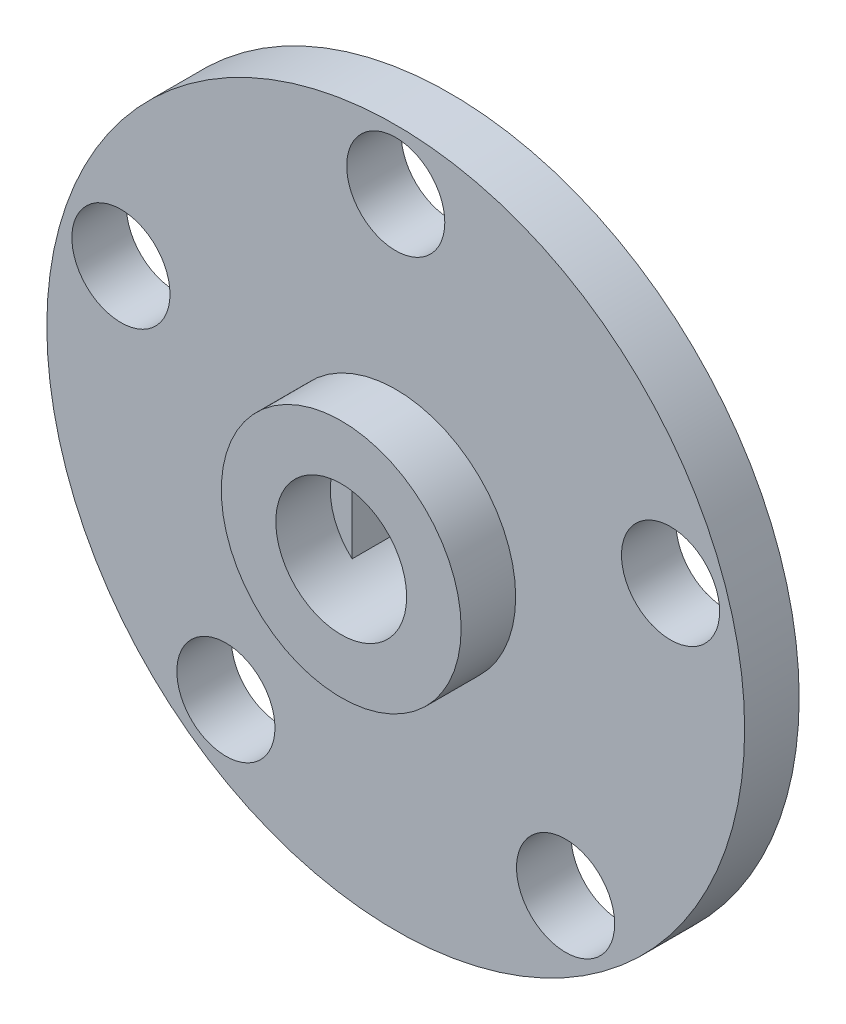
ISO-10303-21;
HEADER;
FILE_DESCRIPTION(('STEP AP214'),'2;1');
FILE_NAME('part.step','',(''),(''),'','','');
FILE_SCHEMA(('AUTOMOTIVE_DESIGN { 1 0 10303 214 1 1 1 1 }'));
ENDSEC;
DATA;
#1=APPLICATION_CONTEXT('core data for automotive mechanical design processes');
#2=APPLICATION_PROTOCOL_DEFINITION('international standard','automotive_design',2000,#1);
#3=PRODUCT_CONTEXT('',#1,'mechanical');
#4=PRODUCT('Part','Part','',(#3));
#5=PRODUCT_RELATED_PRODUCT_CATEGORY('part','',(#4));
#6=PRODUCT_DEFINITION_FORMATION('','',#4);
#7=PRODUCT_DEFINITION_CONTEXT('part definition',#1,'design');
#8=PRODUCT_DEFINITION('design','',#6,#7);
#9=PRODUCT_DEFINITION_SHAPE('','',#8);
#10=(LENGTH_UNIT() NAMED_UNIT(*) SI_UNIT(.MILLI.,.METRE.));
#11=(NAMED_UNIT(*) PLANE_ANGLE_UNIT() SI_UNIT($,.RADIAN.));
#12=(NAMED_UNIT(*) SI_UNIT($,.STERADIAN.) SOLID_ANGLE_UNIT());
#13=UNCERTAINTY_MEASURE_WITH_UNIT(LENGTH_MEASURE(1.E-05),#10,'distance_accuracy_value','');
#14=(GEOMETRIC_REPRESENTATION_CONTEXT(3) GLOBAL_UNCERTAINTY_ASSIGNED_CONTEXT((#13)) GLOBAL_UNIT_ASSIGNED_CONTEXT((#10,
#11,#12)) REPRESENTATION_CONTEXT('',''));
#15=CARTESIAN_POINT('',(0.,0.,0.));
#16=DIRECTION('',(0.,0.,1.));
#17=DIRECTION('',(1.,0.,0.));
#18=AXIS2_PLACEMENT_3D('',#15,#16,#17);
#19=CARTESIAN_POINT('',(32.,0.,0.));
#20=DIRECTION('',(0.,0.,1.));
#21=DIRECTION('',(1.,0.,0.));
#22=AXIS2_PLACEMENT_3D('',#19,#20,#21);
#23=PLANE('',#22);
#24=CARTESIAN_POINT('',(0.,0.,0.));
#25=DIRECTION('',(0.,0.,1.));
#26=DIRECTION('',(1.,0.,0.));
#27=AXIS2_PLACEMENT_3D('',#24,#25,#26);
#28=CIRCLE('',#27,6.);
#29=CARTESIAN_POINT('',(6.,0.,0.));
#30=VERTEX_POINT('',#29);
#31=EDGE_CURVE('E109',#30,#30,#28,.T.);
#32=ORIENTED_EDGE('',*,*,#31,.F.);
#33=EDGE_LOOP('',(#32));
#34=FACE_BOUND('',#33,.T.);
#35=CARTESIAN_POINT('',(0.,0.,0.));
#36=DIRECTION('',(0.,0.,1.));
#37=DIRECTION('',(1.,0.,0.));
#38=AXIS2_PLACEMENT_3D('',#35,#36,#37);
#39=CIRCLE('',#38,11.);
#40=CARTESIAN_POINT('',(11.,0.,0.));
#41=VERTEX_POINT('',#40);
#42=EDGE_CURVE('E127',#41,#41,#39,.T.);
#43=ORIENTED_EDGE('',*,*,#42,.T.);
#44=EDGE_LOOP('',(#43));
#45=FACE_BOUND('',#44,.T.);
#46=ADVANCED_FACE('F49',(#34,#45),#23,.T.);
#47=CARTESIAN_POINT('',(0.,0.,0.));
#48=DIRECTION('',(0.,0.,1.));
#49=DIRECTION('',(1.,0.,0.));
#50=AXIS2_PLACEMENT_3D('',#47,#48,#49);
#51=CYLINDRICAL_SURFACE('',#50,32.);
#52=CARTESIAN_POINT('',(0.,0.,-10.));
#53=DIRECTION('',(0.,0.,1.));
#54=DIRECTION('',(1.,0.,0.));
#55=AXIS2_PLACEMENT_3D('',#52,#53,#54);
#56=CIRCLE('',#55,32.);
#57=CARTESIAN_POINT('',(32.,0.,-10.));
#58=VERTEX_POINT('',#57);
#59=EDGE_CURVE('E113',#58,#58,#56,.T.);
#60=ORIENTED_EDGE('',*,*,#59,.T.);
#61=EDGE_LOOP('',(#60));
#62=FACE_BOUND('',#61,.T.);
#63=CARTESIAN_POINT('',(0.,0.,-5.));
#64=DIRECTION('',(0.,0.,1.));
#65=DIRECTION('',(1.,0.,0.));
#66=AXIS2_PLACEMENT_3D('',#63,#64,#65);
#67=CIRCLE('',#66,32.);
#68=CARTESIAN_POINT('',(32.,0.,-5.));
#69=VERTEX_POINT('',#68);
#70=EDGE_CURVE('E122',#69,#69,#67,.T.);
#71=ORIENTED_EDGE('',*,*,#70,.F.);
#72=EDGE_LOOP('',(#71));
#73=FACE_BOUND('',#72,.T.);
#74=ADVANCED_FACE('F190',(#62,#73),#51,.T.);
#75=CARTESIAN_POINT('',(4.,0.,-5.));
#76=DIRECTION('',(0.,0.,1.));
#77=DIRECTION('',(1.,0.,0.));
#78=AXIS2_PLACEMENT_3D('',#75,#76,#77);
#79=PLANE('',#78);
#80=DIRECTION('',(0.,-1.,0.));
#81=VECTOR('',#80,1.);
#82=CARTESIAN_POINT('',(4.,4.47213595499958,-5.));
#83=LINE('',#82,#81);
#84=CARTESIAN_POINT('',(4.,4.47213595499958,-5.));
#85=VERTEX_POINT('',#84);
#86=CARTESIAN_POINT('',(4.,-4.47213595499958,-5.));
#87=VERTEX_POINT('',#86);
#88=EDGE_CURVE('E101',#85,#87,#83,.T.);
#89=ORIENTED_EDGE('',*,*,#88,.T.);
#90=CARTESIAN_POINT('',(0.,0.,-5.));
#91=DIRECTION('',(0.,0.,1.));
#92=DIRECTION('',(1.,0.,0.));
#93=AXIS2_PLACEMENT_3D('',#90,#91,#92);
#94=CIRCLE('',#93,6.);
#95=EDGE_CURVE('E106',#87,#85,#94,.T.);
#96=ORIENTED_EDGE('',*,*,#95,.T.);
#97=EDGE_LOOP('',(#89,#96));
#98=FACE_BOUND('',#97,.T.);
#99=ADVANCED_FACE('F192',(#98),#79,.T.);
#100=DIRECTION('',(0.,1.,0.));
#101=VECTOR('',#100,1.);
#102=CARTESIAN_POINT('',(-4.,4.47213595499958,-5.));
#103=LINE('',#102,#101);
#104=CARTESIAN_POINT('',(-4.,-4.47213595499958,-5.));
#105=VERTEX_POINT('',#104);
#106=CARTESIAN_POINT('',(-4.,4.47213595499958,-5.));
#107=VERTEX_POINT('',#106);
#108=EDGE_CURVE('E64',#105,#107,#103,.T.);
#109=ORIENTED_EDGE('',*,*,#108,.T.);
#110=EDGE_CURVE('E100',#107,#105,#94,.T.);
#111=ORIENTED_EDGE('',*,*,#110,.T.);
#112=EDGE_LOOP('',(#109,#111));
#113=FACE_BOUND('',#112,.T.);
#114=ADVANCED_FACE('F51',(#113),#79,.T.);
#115=CARTESIAN_POINT('',(0.,0.,0.));
#116=DIRECTION('',(0.,0.,1.));
#117=DIRECTION('',(1.,0.,0.));
#118=AXIS2_PLACEMENT_3D('',#115,#116,#117);
#119=CYLINDRICAL_SURFACE('',#118,6.);
#120=ORIENTED_EDGE('',*,*,#31,.T.);
#121=EDGE_LOOP('',(#120));
#122=FACE_BOUND('',#121,.T.);
#123=ORIENTED_EDGE('',*,*,#110,.F.);
#124=DIRECTION('',(0.,0.,-1.));
#125=VECTOR('',#124,1.);
#126=CARTESIAN_POINT('',(-4.,4.47213595499958,-5.));
#127=LINE('',#126,#125);
#128=CARTESIAN_POINT('',(-4.,4.47213595499958,-10.));
#129=VERTEX_POINT('',#128);
#130=EDGE_CURVE('E89',#107,#129,#127,.T.);
#131=ORIENTED_EDGE('',*,*,#130,.T.);
#132=CARTESIAN_POINT('',(0.,0.,-10.));
#133=DIRECTION('',(0.,0.,-1.));
#134=DIRECTION('',(-1.,0.,0.));
#135=AXIS2_PLACEMENT_3D('',#132,#133,#134);
#136=CIRCLE('',#135,6.);
#137=CARTESIAN_POINT('',(4.,4.47213595499958,-10.));
#138=VERTEX_POINT('',#137);
#139=EDGE_CURVE('E102',#129,#138,#136,.T.);
#140=ORIENTED_EDGE('',*,*,#139,.T.);
#141=DIRECTION('',(0.,0.,-1.));
#142=VECTOR('',#141,1.);
#143=CARTESIAN_POINT('',(4.,4.47213595499958,-5.));
#144=LINE('',#143,#142);
#145=EDGE_CURVE('E95',#85,#138,#144,.T.);
#146=ORIENTED_EDGE('',*,*,#145,.F.);
#147=ORIENTED_EDGE('',*,*,#95,.F.);
#148=DIRECTION('',(0.,0.,-1.));
#149=VECTOR('',#148,1.);
#150=CARTESIAN_POINT('',(4.,-4.47213595499958,-5.));
#151=LINE('',#150,#149);
#152=CARTESIAN_POINT('',(4.,-4.47213595499958,-10.));
#153=VERTEX_POINT('',#152);
#154=EDGE_CURVE('E72',#87,#153,#151,.T.);
#155=ORIENTED_EDGE('',*,*,#154,.T.);
#156=CARTESIAN_POINT('',(0.,0.,-10.));
#157=DIRECTION('',(0.,0.,-1.));
#158=DIRECTION('',(-1.,0.,0.));
#159=AXIS2_PLACEMENT_3D('',#156,#157,#158);
#160=CIRCLE('',#159,6.);
#161=CARTESIAN_POINT('',(-4.,-4.47213595499958,-10.));
#162=VERTEX_POINT('',#161);
#163=EDGE_CURVE('E120',#153,#162,#160,.T.);
#164=ORIENTED_EDGE('',*,*,#163,.T.);
#165=DIRECTION('',(0.,0.,-1.));
#166=VECTOR('',#165,1.);
#167=CARTESIAN_POINT('',(-4.,-4.47213595499958,-5.));
#168=LINE('',#167,#166);
#169=EDGE_CURVE('E96',#105,#162,#168,.T.);
#170=ORIENTED_EDGE('',*,*,#169,.F.);
#171=EDGE_LOOP('',(#123,#131,#140,#146,#147,#155,#164,#170));
#172=FACE_BOUND('',#171,.T.);
#173=ADVANCED_FACE('F104',(#122,#172),#119,.F.);
#174=CARTESIAN_POINT('',(4.,0.,-10.));
#175=DIRECTION('',(0.,0.,-1.));
#176=DIRECTION('',(-1.,0.,0.));
#177=AXIS2_PLACEMENT_3D('',#174,#175,#176);
#178=PLANE('',#177);
#179=CARTESIAN_POINT('',(0.,26.4999999999984,-10.));
#180=DIRECTION('',(0.,0.,1.));
#181=DIRECTION('',(1.,0.,0.));
#182=AXIS2_PLACEMENT_3D('',#179,#180,#181);
#183=CIRCLE('',#182,4.50000000000048);
#184=CARTESIAN_POINT('',(4.50000000000048,26.4999999999984,-10.));
#185=VERTEX_POINT('',#184);
#186=EDGE_CURVE('E130',#185,#185,#183,.T.);
#187=ORIENTED_EDGE('',*,*,#186,.T.);
#188=EDGE_LOOP('',(#187));
#189=FACE_BOUND('',#188,.T.);
#190=CARTESIAN_POINT('',(25.2029976818205,8.18895035093631,-10.));
#191=DIRECTION('',(0.,0.,1.));
#192=DIRECTION('',(1.,0.,0.));
#193=AXIS2_PLACEMENT_3D('',#190,#191,#192);
#194=CIRCLE('',#193,4.50000000000084);
#195=CARTESIAN_POINT('',(29.7029976818214,8.18895035093631,-10.));
#196=VERTEX_POINT('',#195);
#197=EDGE_CURVE('E154',#196,#196,#194,.T.);
#198=ORIENTED_EDGE('',*,*,#197,.T.);
#199=EDGE_LOOP('',(#198));
#200=FACE_BOUND('',#199,.T.);
#201=CARTESIAN_POINT('',(15.5763091857509,-21.4389503509343,-10.));
#202=DIRECTION('',(0.,0.,1.));
#203=DIRECTION('',(1.,0.,0.));
#204=AXIS2_PLACEMENT_3D('',#201,#202,#203);
#205=CIRCLE('',#204,4.50000000000178);
#206=CARTESIAN_POINT('',(20.0763091857527,-21.4389503509343,-10.));
#207=VERTEX_POINT('',#206);
#208=EDGE_CURVE('E148',#207,#207,#205,.T.);
#209=ORIENTED_EDGE('',*,*,#208,.T.);
#210=EDGE_LOOP('',(#209));
#211=FACE_BOUND('',#210,.T.);
#212=CARTESIAN_POINT('',(-15.5763091857482,-21.4389503509352,-10.));
#213=DIRECTION('',(0.,0.,1.));
#214=DIRECTION('',(1.,0.,0.));
#215=AXIS2_PLACEMENT_3D('',#212,#213,#214);
#216=CIRCLE('',#215,4.50000000000212);
#217=CARTESIAN_POINT('',(-11.0763091857461,-21.4389503509352,-10.));
#218=VERTEX_POINT('',#217);
#219=EDGE_CURVE('E142',#218,#218,#216,.T.);
#220=ORIENTED_EDGE('',*,*,#219,.T.);
#221=EDGE_LOOP('',(#220));
#222=FACE_BOUND('',#221,.T.);
#223=CARTESIAN_POINT('',(-25.2029976818195,8.18895035093488,-10.));
#224=DIRECTION('',(0.,0.,1.));
#225=DIRECTION('',(1.,0.,0.));
#226=AXIS2_PLACEMENT_3D('',#223,#224,#225);
#227=CIRCLE('',#226,4.50000000000148);
#228=CARTESIAN_POINT('',(-20.702997681818,8.18895035093488,-10.));
#229=VERTEX_POINT('',#228);
#230=EDGE_CURVE('E136',#229,#229,#227,.T.);
#231=ORIENTED_EDGE('',*,*,#230,.T.);
#232=EDGE_LOOP('',(#231));
#233=FACE_BOUND('',#232,.T.);
#234=DIRECTION('',(0.,-1.,0.));
#235=VECTOR('',#234,1.);
#236=CARTESIAN_POINT('',(4.,0.,-10.));
#237=LINE('',#236,#235);
#238=EDGE_CURVE('E13',#138,#153,#237,.T.);
#239=ORIENTED_EDGE('',*,*,#238,.F.);
#240=ORIENTED_EDGE('',*,*,#139,.F.);
#241=DIRECTION('',(0.,1.,0.));
#242=VECTOR('',#241,1.);
#243=CARTESIAN_POINT('',(-4.,0.,-10.));
#244=LINE('',#243,#242);
#245=EDGE_CURVE('E57',#162,#129,#244,.T.);
#246=ORIENTED_EDGE('',*,*,#245,.F.);
#247=ORIENTED_EDGE('',*,*,#163,.F.);
#248=EDGE_LOOP('',(#239,#240,#246,#247));
#249=FACE_BOUND('',#248,.T.);
#250=ORIENTED_EDGE('',*,*,#59,.F.);
#251=EDGE_LOOP('',(#250));
#252=FACE_BOUND('',#251,.T.);
#253=ADVANCED_FACE('F163',(#189,#200,#211,#222,#233,#249,#252),#178,.T.);
#254=CARTESIAN_POINT('',(4.,4.47213595499958,-5.));
#255=DIRECTION('',(1.,0.,0.));
#256=DIRECTION('',(0.,1.,0.));
#257=AXIS2_PLACEMENT_3D('',#254,#255,#256);
#258=PLANE('',#257);
#259=ORIENTED_EDGE('',*,*,#238,.T.);
#260=ORIENTED_EDGE('',*,*,#154,.F.);
#261=ORIENTED_EDGE('',*,*,#88,.F.);
#262=ORIENTED_EDGE('',*,*,#145,.T.);
#263=EDGE_LOOP('',(#259,#260,#261,#262));
#264=FACE_BOUND('',#263,.T.);
#265=ADVANCED_FACE('F210',(#264),#258,.F.);
#266=CARTESIAN_POINT('',(-4.,4.47213595499958,-5.));
#267=DIRECTION('',(-1.,0.,0.));
#268=DIRECTION('',(0.,-1.,0.));
#269=AXIS2_PLACEMENT_3D('',#266,#267,#268);
#270=PLANE('',#269);
#271=ORIENTED_EDGE('',*,*,#245,.T.);
#272=ORIENTED_EDGE('',*,*,#130,.F.);
#273=ORIENTED_EDGE('',*,*,#108,.F.);
#274=ORIENTED_EDGE('',*,*,#169,.T.);
#275=EDGE_LOOP('',(#271,#272,#273,#274));
#276=FACE_BOUND('',#275,.T.);
#277=ADVANCED_FACE('F90',(#276),#270,.F.);
#278=CARTESIAN_POINT('',(0.,0.,-5.));
#279=DIRECTION('',(0.,0.,1.));
#280=DIRECTION('',(1.,0.,0.));
#281=AXIS2_PLACEMENT_3D('',#278,#279,#280);
#282=PLANE('',#281);
#283=CARTESIAN_POINT('',(0.,26.4999999999984,-5.));
#284=DIRECTION('',(0.,0.,1.));
#285=DIRECTION('',(1.,0.,0.));
#286=AXIS2_PLACEMENT_3D('',#283,#284,#285);
#287=CIRCLE('',#286,4.50000000000048);
#288=CARTESIAN_POINT('',(4.50000000000048,26.4999999999984,-5.));
#289=VERTEX_POINT('',#288);
#290=EDGE_CURVE('E157',#289,#289,#287,.T.);
#291=ORIENTED_EDGE('',*,*,#290,.F.);
#292=EDGE_LOOP('',(#291));
#293=FACE_BOUND('',#292,.T.);
#294=CARTESIAN_POINT('',(25.2029976818205,8.18895035093631,-5.));
#295=DIRECTION('',(0.,0.,1.));
#296=DIRECTION('',(1.,0.,0.));
#297=AXIS2_PLACEMENT_3D('',#294,#295,#296);
#298=CIRCLE('',#297,4.50000000000084);
#299=CARTESIAN_POINT('',(29.7029976818214,8.18895035093631,-5.));
#300=VERTEX_POINT('',#299);
#301=EDGE_CURVE('E151',#300,#300,#298,.T.);
#302=ORIENTED_EDGE('',*,*,#301,.F.);
#303=EDGE_LOOP('',(#302));
#304=FACE_BOUND('',#303,.T.);
#305=CARTESIAN_POINT('',(15.5763091857509,-21.4389503509343,-5.));
#306=DIRECTION('',(0.,0.,1.));
#307=DIRECTION('',(1.,0.,0.));
#308=AXIS2_PLACEMENT_3D('',#305,#306,#307);
#309=CIRCLE('',#308,4.50000000000178);
#310=CARTESIAN_POINT('',(20.0763091857527,-21.4389503509343,-5.));
#311=VERTEX_POINT('',#310);
#312=EDGE_CURVE('E145',#311,#311,#309,.T.);
#313=ORIENTED_EDGE('',*,*,#312,.F.);
#314=EDGE_LOOP('',(#313));
#315=FACE_BOUND('',#314,.T.);
#316=CARTESIAN_POINT('',(-15.5763091857482,-21.4389503509352,-5.));
#317=DIRECTION('',(0.,0.,1.));
#318=DIRECTION('',(1.,0.,0.));
#319=AXIS2_PLACEMENT_3D('',#316,#317,#318);
#320=CIRCLE('',#319,4.50000000000212);
#321=CARTESIAN_POINT('',(-11.0763091857461,-21.4389503509352,-5.));
#322=VERTEX_POINT('',#321);
#323=EDGE_CURVE('E139',#322,#322,#320,.T.);
#324=ORIENTED_EDGE('',*,*,#323,.F.);
#325=EDGE_LOOP('',(#324));
#326=FACE_BOUND('',#325,.T.);
#327=CARTESIAN_POINT('',(-25.2029976818195,8.18895035093488,-5.));
#328=DIRECTION('',(0.,0.,1.));
#329=DIRECTION('',(1.,0.,0.));
#330=AXIS2_PLACEMENT_3D('',#327,#328,#329);
#331=CIRCLE('',#330,4.50000000000148);
#332=CARTESIAN_POINT('',(-20.702997681818,8.18895035093488,-5.));
#333=VERTEX_POINT('',#332);
#334=EDGE_CURVE('E133',#333,#333,#331,.T.);
#335=ORIENTED_EDGE('',*,*,#334,.F.);
#336=EDGE_LOOP('',(#335));
#337=FACE_BOUND('',#336,.T.);
#338=CARTESIAN_POINT('',(0.,0.,-5.));
#339=DIRECTION('',(0.,0.,1.));
#340=DIRECTION('',(1.,0.,0.));
#341=AXIS2_PLACEMENT_3D('',#338,#339,#340);
#342=CIRCLE('',#341,11.);
#343=CARTESIAN_POINT('',(11.,0.,-5.));
#344=VERTEX_POINT('',#343);
#345=EDGE_CURVE('E126',#344,#344,#342,.T.);
#346=ORIENTED_EDGE('',*,*,#345,.F.);
#347=EDGE_LOOP('',(#346));
#348=FACE_BOUND('',#347,.T.);
#349=ORIENTED_EDGE('',*,*,#70,.T.);
#350=EDGE_LOOP('',(#349));
#351=FACE_BOUND('',#350,.T.);
#352=ADVANCED_FACE('F173',(#293,#304,#315,#326,#337,#348,#351),#282,.T.);
#353=CARTESIAN_POINT('',(0.,0.,-5.));
#354=DIRECTION('',(0.,0.,1.));
#355=DIRECTION('',(1.,0.,0.));
#356=AXIS2_PLACEMENT_3D('',#353,#354,#355);
#357=CYLINDRICAL_SURFACE('',#356,11.);
#358=ORIENTED_EDGE('',*,*,#345,.T.);
#359=EDGE_LOOP('',(#358));
#360=FACE_BOUND('',#359,.T.);
#361=ORIENTED_EDGE('',*,*,#42,.F.);
#362=EDGE_LOOP('',(#361));
#363=FACE_BOUND('',#362,.T.);
#364=ADVANCED_FACE('F176',(#360,#363),#357,.T.);
#365=CARTESIAN_POINT('',(-25.2029976818195,8.18895035093488,-10.));
#366=DIRECTION('',(0.,0.,1.));
#367=DIRECTION('',(1.,0.,0.));
#368=AXIS2_PLACEMENT_3D('',#365,#366,#367);
#369=CYLINDRICAL_SURFACE('',#368,4.50000000000148);
#370=ORIENTED_EDGE('',*,*,#230,.F.);
#371=EDGE_LOOP('',(#370));
#372=FACE_BOUND('',#371,.T.);
#373=ORIENTED_EDGE('',*,*,#334,.T.);
#374=EDGE_LOOP('',(#373));
#375=FACE_BOUND('',#374,.T.);
#376=ADVANCED_FACE('F216',(#372,#375),#369,.F.);
#377=CARTESIAN_POINT('',(-15.5763091857482,-21.4389503509352,-10.));
#378=DIRECTION('',(0.,0.,1.));
#379=DIRECTION('',(1.,0.,0.));
#380=AXIS2_PLACEMENT_3D('',#377,#378,#379);
#381=CYLINDRICAL_SURFACE('',#380,4.50000000000212);
#382=ORIENTED_EDGE('',*,*,#219,.F.);
#383=EDGE_LOOP('',(#382));
#384=FACE_BOUND('',#383,.T.);
#385=ORIENTED_EDGE('',*,*,#323,.T.);
#386=EDGE_LOOP('',(#385));
#387=FACE_BOUND('',#386,.T.);
#388=ADVANCED_FACE('F222',(#384,#387),#381,.F.);
#389=CARTESIAN_POINT('',(15.5763091857509,-21.4389503509343,-10.));
#390=DIRECTION('',(0.,0.,1.));
#391=DIRECTION('',(1.,0.,0.));
#392=AXIS2_PLACEMENT_3D('',#389,#390,#391);
#393=CYLINDRICAL_SURFACE('',#392,4.50000000000178);
#394=ORIENTED_EDGE('',*,*,#208,.F.);
#395=EDGE_LOOP('',(#394));
#396=FACE_BOUND('',#395,.T.);
#397=ORIENTED_EDGE('',*,*,#312,.T.);
#398=EDGE_LOOP('',(#397));
#399=FACE_BOUND('',#398,.T.);
#400=ADVANCED_FACE('F258',(#396,#399),#393,.F.);
#401=CARTESIAN_POINT('',(25.2029976818205,8.18895035093631,-10.));
#402=DIRECTION('',(0.,0.,1.));
#403=DIRECTION('',(1.,0.,0.));
#404=AXIS2_PLACEMENT_3D('',#401,#402,#403);
#405=CYLINDRICAL_SURFACE('',#404,4.50000000000084);
#406=ORIENTED_EDGE('',*,*,#197,.F.);
#407=EDGE_LOOP('',(#406));
#408=FACE_BOUND('',#407,.T.);
#409=ORIENTED_EDGE('',*,*,#301,.T.);
#410=EDGE_LOOP('',(#409));
#411=FACE_BOUND('',#410,.T.);
#412=ADVANCED_FACE('F169',(#408,#411),#405,.F.);
#413=CARTESIAN_POINT('',(0.,26.4999999999984,-10.));
#414=DIRECTION('',(0.,0.,1.));
#415=DIRECTION('',(1.,0.,0.));
#416=AXIS2_PLACEMENT_3D('',#413,#414,#415);
#417=CYLINDRICAL_SURFACE('',#416,4.50000000000048);
#418=ORIENTED_EDGE('',*,*,#186,.F.);
#419=EDGE_LOOP('',(#418));
#420=FACE_BOUND('',#419,.T.);
#421=ORIENTED_EDGE('',*,*,#290,.T.);
#422=EDGE_LOOP('',(#421));
#423=FACE_BOUND('',#422,.T.);
#424=ADVANCED_FACE('F166',(#420,#423),#417,.F.);
#425=CLOSED_SHELL('',(#46,#74,#99,#114,#173,#253,#265,#277,#352,#364,#376,#388,#400,#412,#424));
#426=MANIFOLD_SOLID_BREP('B2',#425);
#427=ADVANCED_BREP_SHAPE_REPRESENTATION('',(#18,#426),#14);
#428=SHAPE_DEFINITION_REPRESENTATION(#9,#427);
ENDSEC;
END-ISO-10303-21;
